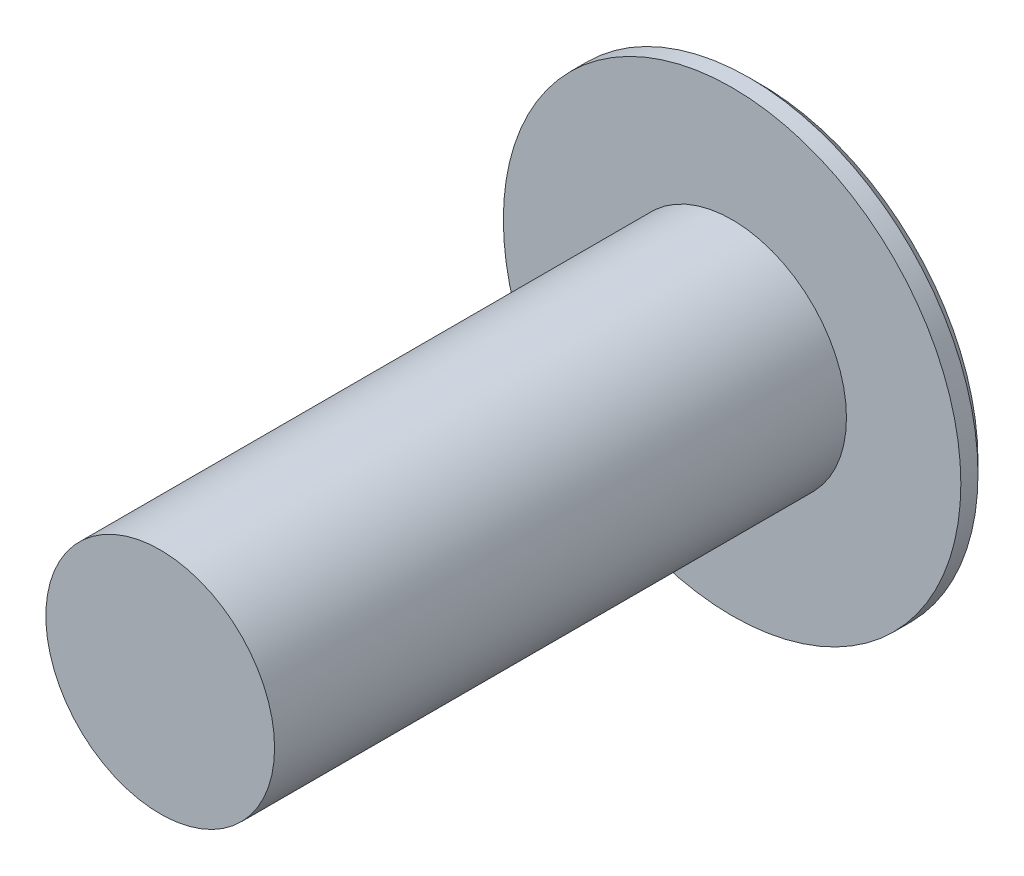
ISO-10303-21;
HEADER;
FILE_DESCRIPTION(('STEP AP214'),'2;1');
FILE_NAME('part.step','',(''),(''),'','','');
FILE_SCHEMA(('AUTOMOTIVE_DESIGN { 1 0 10303 214 1 1 1 1 }'));
ENDSEC;
DATA;
#1=APPLICATION_CONTEXT('core data for automotive mechanical design processes');
#2=APPLICATION_PROTOCOL_DEFINITION('international standard','automotive_design',2000,#1);
#3=PRODUCT_CONTEXT('',#1,'mechanical');
#4=PRODUCT('Part','Part','',(#3));
#5=PRODUCT_RELATED_PRODUCT_CATEGORY('part','',(#4));
#6=PRODUCT_DEFINITION_FORMATION('','',#4);
#7=PRODUCT_DEFINITION_CONTEXT('part definition',#1,'design');
#8=PRODUCT_DEFINITION('design','',#6,#7);
#9=PRODUCT_DEFINITION_SHAPE('','',#8);
#10=(LENGTH_UNIT() NAMED_UNIT(*) SI_UNIT(.MILLI.,.METRE.));
#11=(NAMED_UNIT(*) PLANE_ANGLE_UNIT() SI_UNIT($,.RADIAN.));
#12=(NAMED_UNIT(*) SI_UNIT($,.STERADIAN.) SOLID_ANGLE_UNIT());
#13=UNCERTAINTY_MEASURE_WITH_UNIT(LENGTH_MEASURE(1.E-05),#10,'distance_accuracy_value','');
#14=(GEOMETRIC_REPRESENTATION_CONTEXT(3) GLOBAL_UNCERTAINTY_ASSIGNED_CONTEXT((#13)) GLOBAL_UNIT_ASSIGNED_CONTEXT((#10,
#11,#12)) REPRESENTATION_CONTEXT('',''));
#15=CARTESIAN_POINT('',(0.,0.,0.));
#16=DIRECTION('',(0.,0.,1.));
#17=DIRECTION('',(1.,0.,0.));
#18=AXIS2_PLACEMENT_3D('',#15,#16,#17);
#19=CARTESIAN_POINT('',(0.,0.,100.));
#20=DIRECTION('',(0.,0.,-1.));
#21=DIRECTION('',(-1.,0.,0.));
#22=AXIS2_PLACEMENT_3D('',#19,#20,#21);
#23=CYLINDRICAL_SURFACE('',#22,20.);
#24=CARTESIAN_POINT('',(0.,0.,100.));
#25=DIRECTION('',(0.,0.,1.));
#26=DIRECTION('',(1.,0.,0.));
#27=AXIS2_PLACEMENT_3D('',#24,#25,#26);
#28=CIRCLE('',#27,20.);
#29=CARTESIAN_POINT('',(20.,0.,100.));
#30=VERTEX_POINT('',#29);
#31=EDGE_CURVE('E47',#30,#30,#28,.T.);
#32=ORIENTED_EDGE('',*,*,#31,.F.);
#33=EDGE_LOOP('',(#32));
#34=FACE_BOUND('',#33,.T.);
#35=CARTESIAN_POINT('',(0.,0.,0.));
#36=DIRECTION('',(0.,0.,1.));
#37=DIRECTION('',(1.,0.,0.));
#38=AXIS2_PLACEMENT_3D('',#35,#36,#37);
#39=CIRCLE('',#38,20.);
#40=CARTESIAN_POINT('',(20.,0.,0.));
#41=VERTEX_POINT('',#40);
#42=EDGE_CURVE('E51',#41,#41,#39,.T.);
#43=ORIENTED_EDGE('',*,*,#42,.T.);
#44=EDGE_LOOP('',(#43));
#45=FACE_BOUND('',#44,.T.);
#46=ADVANCED_FACE('F36',(#34,#45),#23,.T.);
#47=CARTESIAN_POINT('',(0.,0.,100.));
#48=DIRECTION('',(0.,0.,1.));
#49=DIRECTION('',(1.,0.,0.));
#50=AXIS2_PLACEMENT_3D('',#47,#48,#49);
#51=PLANE('',#50);
#52=ORIENTED_EDGE('',*,*,#31,.T.);
#53=EDGE_LOOP('',(#52));
#54=FACE_BOUND('',#53,.T.);
#55=ADVANCED_FACE('F76',(#54),#51,.T.);
#56=CARTESIAN_POINT('',(0.,0.,-5.));
#57=DIRECTION('',(0.,0.,1.));
#58=DIRECTION('',(1.,0.,0.));
#59=AXIS2_PLACEMENT_3D('',#56,#57,#58);
#60=CYLINDRICAL_SURFACE('',#59,40.);
#61=CARTESIAN_POINT('',(0.,0.,-2.99999999999998));
#62=DIRECTION('',(0.,0.,-1.));
#63=DIRECTION('',(-1.,0.,0.));
#64=AXIS2_PLACEMENT_3D('',#61,#62,#63);
#65=CIRCLE('',#64,40.);
#66=CARTESIAN_POINT('',(-40.,0.,-2.99999999999998));
#67=VERTEX_POINT('',#66);
#68=EDGE_CURVE('E10',#67,#67,#65,.F.);
#69=ORIENTED_EDGE('',*,*,#68,.T.);
#70=EDGE_LOOP('',(#69));
#71=FACE_BOUND('',#70,.T.);
#72=CARTESIAN_POINT('',(0.,0.,0.));
#73=DIRECTION('',(0.,0.,-1.));
#74=DIRECTION('',(-1.,0.,0.));
#75=AXIS2_PLACEMENT_3D('',#72,#73,#74);
#76=CIRCLE('',#75,40.);
#77=CARTESIAN_POINT('',(-40.,0.,0.));
#78=VERTEX_POINT('',#77);
#79=EDGE_CURVE('E55',#78,#78,#76,.T.);
#80=ORIENTED_EDGE('',*,*,#79,.T.);
#81=EDGE_LOOP('',(#80));
#82=FACE_BOUND('',#81,.T.);
#83=ADVANCED_FACE('F60',(#71,#82),#60,.T.);
#84=CARTESIAN_POINT('',(0.,0.,-5.));
#85=DIRECTION('',(0.,0.,-1.));
#86=DIRECTION('',(-1.,0.,0.));
#87=AXIS2_PLACEMENT_3D('',#84,#85,#86);
#88=PLANE('',#87);
#89=CARTESIAN_POINT('',(0.,0.,-5.));
#90=DIRECTION('',(0.,0.,-1.));
#91=DIRECTION('',(-1.,0.,0.));
#92=AXIS2_PLACEMENT_3D('',#89,#90,#91);
#93=CIRCLE('',#92,38.);
#94=CARTESIAN_POINT('',(-38.,0.,-5.));
#95=VERTEX_POINT('',#94);
#96=EDGE_CURVE('E43',#95,#95,#93,.T.);
#97=ORIENTED_EDGE('',*,*,#96,.T.);
#98=EDGE_LOOP('',(#97));
#99=FACE_BOUND('',#98,.T.);
#100=ADVANCED_FACE('F64',(#99),#88,.T.);
#101=CARTESIAN_POINT('',(0.,0.,0.));
#102=DIRECTION('',(0.,0.,-1.));
#103=DIRECTION('',(-1.,0.,0.));
#104=AXIS2_PLACEMENT_3D('',#101,#102,#103);
#105=PLANE('',#104);
#106=ORIENTED_EDGE('',*,*,#42,.F.);
#107=EDGE_LOOP('',(#106));
#108=FACE_BOUND('',#107,.T.);
#109=ORIENTED_EDGE('',*,*,#79,.F.);
#110=EDGE_LOOP('',(#109));
#111=FACE_BOUND('',#110,.T.);
#112=ADVANCED_FACE('F62',(#108,#111),#105,.F.);
#113=CARTESIAN_POINT('',(0.,0.,-5.));
#114=DIRECTION('',(0.,0.,1.));
#115=DIRECTION('',(1.,0.,0.));
#116=AXIS2_PLACEMENT_3D('',#113,#114,#115);
#117=CONICAL_SURFACE('',#116,38.,0.785398163397441);
#118=ORIENTED_EDGE('',*,*,#68,.F.);
#119=EDGE_LOOP('',(#118));
#120=FACE_BOUND('',#119,.T.);
#121=ORIENTED_EDGE('',*,*,#96,.F.);
#122=EDGE_LOOP('',(#121));
#123=FACE_BOUND('',#122,.T.);
#124=ADVANCED_FACE('F38',(#120,#123),#117,.T.);
#125=CLOSED_SHELL('',(#46,#55,#83,#100,#112,#124));
#126=MANIFOLD_SOLID_BREP('B2',#125);
#127=ADVANCED_BREP_SHAPE_REPRESENTATION('',(#18,#126),#14);
#128=SHAPE_DEFINITION_REPRESENTATION(#9,#127);
ENDSEC;
END-ISO-10303-21;
